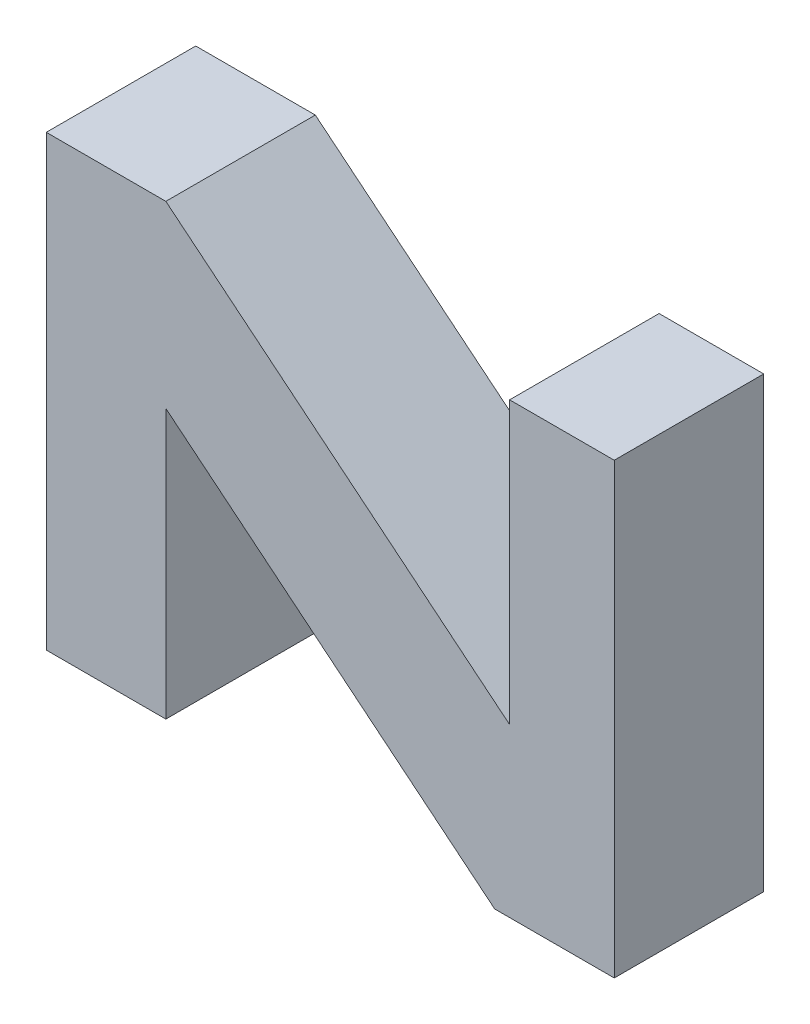
ISO-10303-21;
HEADER;
FILE_DESCRIPTION(('STEP AP214'),'2;1');
FILE_NAME('part.step','',(''),(''),'','','');
FILE_SCHEMA(('AUTOMOTIVE_DESIGN { 1 0 10303 214 1 1 1 1 }'));
ENDSEC;
DATA;
#1=APPLICATION_CONTEXT('core data for automotive mechanical design processes');
#2=APPLICATION_PROTOCOL_DEFINITION('international standard','automotive_design',2000,#1);
#3=PRODUCT_CONTEXT('',#1,'mechanical');
#4=PRODUCT('Part','Part','',(#3));
#5=PRODUCT_RELATED_PRODUCT_CATEGORY('part','',(#4));
#6=PRODUCT_DEFINITION_FORMATION('','',#4);
#7=PRODUCT_DEFINITION_CONTEXT('part definition',#1,'design');
#8=PRODUCT_DEFINITION('design','',#6,#7);
#9=PRODUCT_DEFINITION_SHAPE('','',#8);
#10=(LENGTH_UNIT() NAMED_UNIT(*) SI_UNIT(.MILLI.,.METRE.));
#11=(NAMED_UNIT(*) PLANE_ANGLE_UNIT() SI_UNIT($,.RADIAN.));
#12=(NAMED_UNIT(*) SI_UNIT($,.STERADIAN.) SOLID_ANGLE_UNIT());
#13=UNCERTAINTY_MEASURE_WITH_UNIT(LENGTH_MEASURE(1.E-05),#10,'distance_accuracy_value','');
#14=(GEOMETRIC_REPRESENTATION_CONTEXT(3) GLOBAL_UNCERTAINTY_ASSIGNED_CONTEXT((#13)) GLOBAL_UNIT_ASSIGNED_CONTEXT((#10,
#11,#12)) REPRESENTATION_CONTEXT('',''));
#15=CARTESIAN_POINT('',(0.,0.,0.));
#16=DIRECTION('',(0.,0.,1.));
#17=DIRECTION('',(1.,0.,0.));
#18=AXIS2_PLACEMENT_3D('',#15,#16,#17);
#19=CARTESIAN_POINT('',(0.,0.,5.));
#20=DIRECTION('',(0.,1.,0.));
#21=DIRECTION('',(0.,0.,1.));
#22=AXIS2_PLACEMENT_3D('',#19,#20,#21);
#23=PLANE('',#22);
#24=DIRECTION('',(1.,0.,0.));
#25=VECTOR('',#24,1.);
#26=CARTESIAN_POINT('',(0.,0.,-5.));
#27=LINE('',#26,#25);
#28=CARTESIAN_POINT('',(0.,0.,-5.));
#29=VERTEX_POINT('',#28);
#30=CARTESIAN_POINT('',(8.,0.,-5.));
#31=VERTEX_POINT('',#30);
#32=EDGE_CURVE('E156',#29,#31,#27,.T.);
#33=ORIENTED_EDGE('',*,*,#32,.T.);
#34=DIRECTION('',(0.,0.,-1.));
#35=VECTOR('',#34,1.);
#36=CARTESIAN_POINT('',(8.,0.,5.));
#37=LINE('',#36,#35);
#38=CARTESIAN_POINT('',(8.,0.,5.));
#39=VERTEX_POINT('',#38);
#40=EDGE_CURVE('E11',#39,#31,#37,.T.);
#41=ORIENTED_EDGE('',*,*,#40,.F.);
#42=DIRECTION('',(1.,0.,0.));
#43=VECTOR('',#42,1.);
#44=CARTESIAN_POINT('',(0.,0.,5.));
#45=LINE('',#44,#43);
#46=CARTESIAN_POINT('',(0.,0.,5.));
#47=VERTEX_POINT('',#46);
#48=EDGE_CURVE('E184',#47,#39,#45,.T.);
#49=ORIENTED_EDGE('',*,*,#48,.F.);
#50=DIRECTION('',(0.,0.,-1.));
#51=VECTOR('',#50,1.);
#52=CARTESIAN_POINT('',(0.,0.,5.));
#53=LINE('',#52,#51);
#54=EDGE_CURVE('E152',#47,#29,#53,.T.);
#55=ORIENTED_EDGE('',*,*,#54,.T.);
#56=EDGE_LOOP('',(#33,#41,#49,#55));
#57=FACE_BOUND('',#56,.T.);
#58=ADVANCED_FACE('F43',(#57),#23,.F.);
#59=CARTESIAN_POINT('',(8.,0.,5.));
#60=DIRECTION('',(-1.,0.,0.));
#61=DIRECTION('',(0.,0.,1.));
#62=AXIS2_PLACEMENT_3D('',#59,#60,#61);
#63=PLANE('',#62);
#64=DIRECTION('',(0.,1.,0.));
#65=VECTOR('',#64,1.);
#66=CARTESIAN_POINT('',(8.,0.,-5.));
#67=LINE('',#66,#65);
#68=CARTESIAN_POINT('',(8.,18.,-5.));
#69=VERTEX_POINT('',#68);
#70=EDGE_CURVE('E160',#31,#69,#67,.T.);
#71=ORIENTED_EDGE('',*,*,#70,.T.);
#72=DIRECTION('',(0.,0.,-1.));
#73=VECTOR('',#72,1.);
#74=CARTESIAN_POINT('',(8.,18.,5.));
#75=LINE('',#74,#73);
#76=CARTESIAN_POINT('',(8.,18.,5.));
#77=VERTEX_POINT('',#76);
#78=EDGE_CURVE('E52',#77,#69,#75,.T.);
#79=ORIENTED_EDGE('',*,*,#78,.F.);
#80=DIRECTION('',(0.,1.,0.));
#81=VECTOR('',#80,1.);
#82=CARTESIAN_POINT('',(8.,0.,5.));
#83=LINE('',#82,#81);
#84=EDGE_CURVE('E109',#39,#77,#83,.T.);
#85=ORIENTED_EDGE('',*,*,#84,.F.);
#86=ORIENTED_EDGE('',*,*,#40,.T.);
#87=EDGE_LOOP('',(#71,#79,#85,#86));
#88=FACE_BOUND('',#87,.T.);
#89=ADVANCED_FACE('F248',(#88),#63,.F.);
#90=CARTESIAN_POINT('',(8.,18.,5.));
#91=DIRECTION('',(0.633237790257263,0.773957299203321,0.));
#92=DIRECTION('',(-0.773957299203321,0.633237790257263,0.));
#93=AXIS2_PLACEMENT_3D('',#90,#91,#92);
#94=PLANE('',#93);
#95=DIRECTION('',(0.773957299203321,-0.633237790257263,0.));
#96=VECTOR('',#95,1.);
#97=CARTESIAN_POINT('',(8.,18.,-5.));
#98=LINE('',#97,#96);
#99=CARTESIAN_POINT('',(30.,0.,-5.));
#100=VERTEX_POINT('',#99);
#101=EDGE_CURVE('E163',#69,#100,#98,.T.);
#102=ORIENTED_EDGE('',*,*,#101,.T.);
#103=DIRECTION('',(0.,0.,-1.));
#104=VECTOR('',#103,1.);
#105=CARTESIAN_POINT('',(30.,0.,5.));
#106=LINE('',#105,#104);
#107=CARTESIAN_POINT('',(30.,0.,5.));
#108=VERTEX_POINT('',#107);
#109=EDGE_CURVE('E203',#108,#100,#106,.T.);
#110=ORIENTED_EDGE('',*,*,#109,.F.);
#111=DIRECTION('',(0.773957299203321,-0.633237790257263,0.));
#112=VECTOR('',#111,1.);
#113=CARTESIAN_POINT('',(8.,18.,5.));
#114=LINE('',#113,#112);
#115=EDGE_CURVE('E213',#77,#108,#114,.T.);
#116=ORIENTED_EDGE('',*,*,#115,.F.);
#117=ORIENTED_EDGE('',*,*,#78,.T.);
#118=EDGE_LOOP('',(#102,#110,#116,#117));
#119=FACE_BOUND('',#118,.T.);
#120=ADVANCED_FACE('F211',(#119),#94,.F.);
#121=CARTESIAN_POINT('',(30.,0.,5.));
#122=DIRECTION('',(0.,1.,0.));
#123=DIRECTION('',(0.,0.,1.));
#124=AXIS2_PLACEMENT_3D('',#121,#122,#123);
#125=PLANE('',#124);
#126=DIRECTION('',(1.,0.,0.));
#127=VECTOR('',#126,1.);
#128=CARTESIAN_POINT('',(30.,0.,-5.));
#129=LINE('',#128,#127);
#130=CARTESIAN_POINT('',(38.,0.,-5.));
#131=VERTEX_POINT('',#130);
#132=EDGE_CURVE('E166',#100,#131,#129,.T.);
#133=ORIENTED_EDGE('',*,*,#132,.T.);
#134=DIRECTION('',(0.,0.,-1.));
#135=VECTOR('',#134,1.);
#136=CARTESIAN_POINT('',(38.,0.,5.));
#137=LINE('',#136,#135);
#138=CARTESIAN_POINT('',(38.,0.,5.));
#139=VERTEX_POINT('',#138);
#140=EDGE_CURVE('E199',#139,#131,#137,.T.);
#141=ORIENTED_EDGE('',*,*,#140,.F.);
#142=DIRECTION('',(1.,0.,0.));
#143=VECTOR('',#142,1.);
#144=CARTESIAN_POINT('',(30.,0.,5.));
#145=LINE('',#144,#143);
#146=EDGE_CURVE('E232',#108,#139,#145,.T.);
#147=ORIENTED_EDGE('',*,*,#146,.F.);
#148=ORIENTED_EDGE('',*,*,#109,.T.);
#149=EDGE_LOOP('',(#133,#141,#147,#148));
#150=FACE_BOUND('',#149,.T.);
#151=ADVANCED_FACE('F222',(#150),#125,.F.);
#152=CARTESIAN_POINT('',(38.,30.,5.));
#153=DIRECTION('',(-1.,0.,0.));
#154=DIRECTION('',(0.,0.,1.));
#155=AXIS2_PLACEMENT_3D('',#152,#153,#154);
#156=PLANE('',#155);
#157=DIRECTION('',(0.,1.,0.));
#158=VECTOR('',#157,1.);
#159=CARTESIAN_POINT('',(38.,30.,-5.));
#160=LINE('',#159,#158);
#161=CARTESIAN_POINT('',(38.,30.,-5.));
#162=VERTEX_POINT('',#161);
#163=EDGE_CURVE('E169',#131,#162,#160,.T.);
#164=ORIENTED_EDGE('',*,*,#163,.T.);
#165=DIRECTION('',(0.,0.,-1.));
#166=VECTOR('',#165,1.);
#167=CARTESIAN_POINT('',(38.,30.,5.));
#168=LINE('',#167,#166);
#169=CARTESIAN_POINT('',(38.,30.,5.));
#170=VERTEX_POINT('',#169);
#171=EDGE_CURVE('E195',#170,#162,#168,.T.);
#172=ORIENTED_EDGE('',*,*,#171,.F.);
#173=DIRECTION('',(0.,1.,0.));
#174=VECTOR('',#173,1.);
#175=CARTESIAN_POINT('',(38.,30.,5.));
#176=LINE('',#175,#174);
#177=EDGE_CURVE('E228',#139,#170,#176,.T.);
#178=ORIENTED_EDGE('',*,*,#177,.F.);
#179=ORIENTED_EDGE('',*,*,#140,.T.);
#180=EDGE_LOOP('',(#164,#172,#178,#179));
#181=FACE_BOUND('',#180,.T.);
#182=ADVANCED_FACE('F226',(#181),#156,.F.);
#183=CARTESIAN_POINT('',(31.,30.,5.));
#184=DIRECTION('',(0.,-1.,0.));
#185=DIRECTION('',(0.,0.,-1.));
#186=AXIS2_PLACEMENT_3D('',#183,#184,#185);
#187=PLANE('',#186);
#188=DIRECTION('',(-1.,0.,0.));
#189=VECTOR('',#188,1.);
#190=CARTESIAN_POINT('',(31.,30.,-5.));
#191=LINE('',#190,#189);
#192=CARTESIAN_POINT('',(31.,30.,-5.));
#193=VERTEX_POINT('',#192);
#194=EDGE_CURVE('E172',#162,#193,#191,.T.);
#195=ORIENTED_EDGE('',*,*,#194,.T.);
#196=DIRECTION('',(0.,0.,-1.));
#197=VECTOR('',#196,1.);
#198=CARTESIAN_POINT('',(31.,30.,5.));
#199=LINE('',#198,#197);
#200=CARTESIAN_POINT('',(31.,30.,5.));
#201=VERTEX_POINT('',#200);
#202=EDGE_CURVE('E191',#201,#193,#199,.T.);
#203=ORIENTED_EDGE('',*,*,#202,.F.);
#204=DIRECTION('',(-1.,0.,0.));
#205=VECTOR('',#204,1.);
#206=CARTESIAN_POINT('',(31.,30.,5.));
#207=LINE('',#206,#205);
#208=EDGE_CURVE('E231',#170,#201,#207,.T.);
#209=ORIENTED_EDGE('',*,*,#208,.F.);
#210=ORIENTED_EDGE('',*,*,#171,.T.);
#211=EDGE_LOOP('',(#195,#203,#209,#210));
#212=FACE_BOUND('',#211,.T.);
#213=ADVANCED_FACE('F260',(#212),#187,.F.);
#214=CARTESIAN_POINT('',(31.,11.1818181818182,5.));
#215=DIRECTION('',(1.,0.,0.));
#216=DIRECTION('',(0.,0.,-1.));
#217=AXIS2_PLACEMENT_3D('',#214,#215,#216);
#218=PLANE('',#217);
#219=DIRECTION('',(0.,-1.,0.));
#220=VECTOR('',#219,1.);
#221=CARTESIAN_POINT('',(31.,11.1818181818182,-5.));
#222=LINE('',#221,#220);
#223=CARTESIAN_POINT('',(31.,11.1818181818182,-5.));
#224=VERTEX_POINT('',#223);
#225=EDGE_CURVE('E175',#193,#224,#222,.T.);
#226=ORIENTED_EDGE('',*,*,#225,.T.);
#227=DIRECTION('',(0.,0.,-1.));
#228=VECTOR('',#227,1.);
#229=CARTESIAN_POINT('',(31.,11.1818181818182,5.));
#230=LINE('',#229,#228);
#231=CARTESIAN_POINT('',(31.,11.1818181818182,5.));
#232=VERTEX_POINT('',#231);
#233=EDGE_CURVE('E145',#232,#224,#230,.T.);
#234=ORIENTED_EDGE('',*,*,#233,.F.);
#235=DIRECTION('',(0.,-1.,0.));
#236=VECTOR('',#235,1.);
#237=CARTESIAN_POINT('',(31.,11.1818181818182,5.));
#238=LINE('',#237,#236);
#239=EDGE_CURVE('E134',#201,#232,#238,.T.);
#240=ORIENTED_EDGE('',*,*,#239,.F.);
#241=ORIENTED_EDGE('',*,*,#202,.T.);
#242=EDGE_LOOP('',(#226,#234,#240,#241));
#243=FACE_BOUND('',#242,.T.);
#244=ADVANCED_FACE('F263',(#243),#218,.F.);
#245=CARTESIAN_POINT('',(8.,30.,5.));
#246=DIRECTION('',(-0.633237790257263,-0.773957299203321,0.));
#247=DIRECTION('',(0.773957299203321,-0.633237790257263,0.));
#248=AXIS2_PLACEMENT_3D('',#245,#246,#247);
#249=PLANE('',#248);
#250=DIRECTION('',(-0.773957299203321,0.633237790257263,0.));
#251=VECTOR('',#250,1.);
#252=CARTESIAN_POINT('',(8.,30.,-5.));
#253=LINE('',#252,#251);
#254=CARTESIAN_POINT('',(8.,30.,-5.));
#255=VERTEX_POINT('',#254);
#256=EDGE_CURVE('E143',#224,#255,#253,.T.);
#257=ORIENTED_EDGE('',*,*,#256,.T.);
#258=DIRECTION('',(0.,0.,-1.));
#259=VECTOR('',#258,1.);
#260=CARTESIAN_POINT('',(8.,30.,5.));
#261=LINE('',#260,#259);
#262=CARTESIAN_POINT('',(8.,30.,5.));
#263=VERTEX_POINT('',#262);
#264=EDGE_CURVE('E140',#263,#255,#261,.T.);
#265=ORIENTED_EDGE('',*,*,#264,.F.);
#266=DIRECTION('',(-0.773957299203321,0.633237790257263,0.));
#267=VECTOR('',#266,1.);
#268=CARTESIAN_POINT('',(8.,30.,5.));
#269=LINE('',#268,#267);
#270=EDGE_CURVE('E128',#232,#263,#269,.T.);
#271=ORIENTED_EDGE('',*,*,#270,.F.);
#272=ORIENTED_EDGE('',*,*,#233,.T.);
#273=EDGE_LOOP('',(#257,#265,#271,#272));
#274=FACE_BOUND('',#273,.T.);
#275=ADVANCED_FACE('F141',(#274),#249,.F.);
#276=CARTESIAN_POINT('',(0.,30.,5.));
#277=DIRECTION('',(0.,-1.,0.));
#278=DIRECTION('',(0.,0.,-1.));
#279=AXIS2_PLACEMENT_3D('',#276,#277,#278);
#280=PLANE('',#279);
#281=DIRECTION('',(-1.,0.,0.));
#282=VECTOR('',#281,1.);
#283=CARTESIAN_POINT('',(0.,30.,-5.));
#284=LINE('',#283,#282);
#285=CARTESIAN_POINT('',(0.,30.,-5.));
#286=VERTEX_POINT('',#285);
#287=EDGE_CURVE('E95',#255,#286,#284,.T.);
#288=ORIENTED_EDGE('',*,*,#287,.T.);
#289=DIRECTION('',(0.,0.,-1.));
#290=VECTOR('',#289,1.);
#291=CARTESIAN_POINT('',(0.,30.,5.));
#292=LINE('',#291,#290);
#293=CARTESIAN_POINT('',(0.,30.,5.));
#294=VERTEX_POINT('',#293);
#295=EDGE_CURVE('E146',#294,#286,#292,.T.);
#296=ORIENTED_EDGE('',*,*,#295,.F.);
#297=DIRECTION('',(-1.,0.,0.));
#298=VECTOR('',#297,1.);
#299=CARTESIAN_POINT('',(0.,30.,5.));
#300=LINE('',#299,#298);
#301=EDGE_CURVE('E132',#263,#294,#300,.T.);
#302=ORIENTED_EDGE('',*,*,#301,.F.);
#303=ORIENTED_EDGE('',*,*,#264,.T.);
#304=EDGE_LOOP('',(#288,#296,#302,#303));
#305=FACE_BOUND('',#304,.T.);
#306=ADVANCED_FACE('F148',(#305),#280,.F.);
#307=CARTESIAN_POINT('',(0.,0.,5.));
#308=DIRECTION('',(1.,0.,0.));
#309=DIRECTION('',(0.,0.,-1.));
#310=AXIS2_PLACEMENT_3D('',#307,#308,#309);
#311=PLANE('',#310);
#312=DIRECTION('',(0.,-1.,0.));
#313=VECTOR('',#312,1.);
#314=CARTESIAN_POINT('',(0.,0.,-5.));
#315=LINE('',#314,#313);
#316=EDGE_CURVE('E101',#286,#29,#315,.T.);
#317=ORIENTED_EDGE('',*,*,#316,.T.);
#318=ORIENTED_EDGE('',*,*,#54,.F.);
#319=DIRECTION('',(0.,-1.,0.));
#320=VECTOR('',#319,1.);
#321=CARTESIAN_POINT('',(0.,0.,5.));
#322=LINE('',#321,#320);
#323=EDGE_CURVE('E60',#294,#47,#322,.T.);
#324=ORIENTED_EDGE('',*,*,#323,.F.);
#325=ORIENTED_EDGE('',*,*,#295,.T.);
#326=EDGE_LOOP('',(#317,#318,#324,#325));
#327=FACE_BOUND('',#326,.T.);
#328=ADVANCED_FACE('F272',(#327),#311,.F.);
#329=CARTESIAN_POINT('',(0.,0.,5.));
#330=DIRECTION('',(0.,0.,1.));
#331=DIRECTION('',(1.,0.,0.));
#332=AXIS2_PLACEMENT_3D('',#329,#330,#331);
#333=PLANE('',#332);
#334=ORIENTED_EDGE('',*,*,#48,.T.);
#335=ORIENTED_EDGE('',*,*,#84,.T.);
#336=ORIENTED_EDGE('',*,*,#115,.T.);
#337=ORIENTED_EDGE('',*,*,#146,.T.);
#338=ORIENTED_EDGE('',*,*,#177,.T.);
#339=ORIENTED_EDGE('',*,*,#208,.T.);
#340=ORIENTED_EDGE('',*,*,#239,.T.);
#341=ORIENTED_EDGE('',*,*,#270,.T.);
#342=ORIENTED_EDGE('',*,*,#301,.T.);
#343=ORIENTED_EDGE('',*,*,#323,.T.);
#344=EDGE_LOOP('',(#334,#335,#336,#337,#338,#339,#340,#341,#342,#343));
#345=FACE_BOUND('',#344,.T.);
#346=ADVANCED_FACE('F130',(#345),#333,.T.);
#347=CARTESIAN_POINT('',(0.,0.,-5.));
#348=DIRECTION('',(0.,0.,1.));
#349=DIRECTION('',(1.,0.,0.));
#350=AXIS2_PLACEMENT_3D('',#347,#348,#349);
#351=PLANE('',#350);
#352=ORIENTED_EDGE('',*,*,#32,.F.);
#353=ORIENTED_EDGE('',*,*,#316,.F.);
#354=ORIENTED_EDGE('',*,*,#287,.F.);
#355=ORIENTED_EDGE('',*,*,#256,.F.);
#356=ORIENTED_EDGE('',*,*,#225,.F.);
#357=ORIENTED_EDGE('',*,*,#194,.F.);
#358=ORIENTED_EDGE('',*,*,#163,.F.);
#359=ORIENTED_EDGE('',*,*,#132,.F.);
#360=ORIENTED_EDGE('',*,*,#101,.F.);
#361=ORIENTED_EDGE('',*,*,#70,.F.);
#362=EDGE_LOOP('',(#352,#353,#354,#355,#356,#357,#358,#359,#360,#361));
#363=FACE_BOUND('',#362,.T.);
#364=ADVANCED_FACE('F217',(#363),#351,.F.);
#365=CLOSED_SHELL('',(#58,#89,#120,#151,#182,#213,#244,#275,#306,#328,#346,#364));
#366=MANIFOLD_SOLID_BREP('B2',#365);
#367=ADVANCED_BREP_SHAPE_REPRESENTATION('',(#18,#366),#14);
#368=SHAPE_DEFINITION_REPRESENTATION(#9,#367);
ENDSEC;
END-ISO-10303-21;
